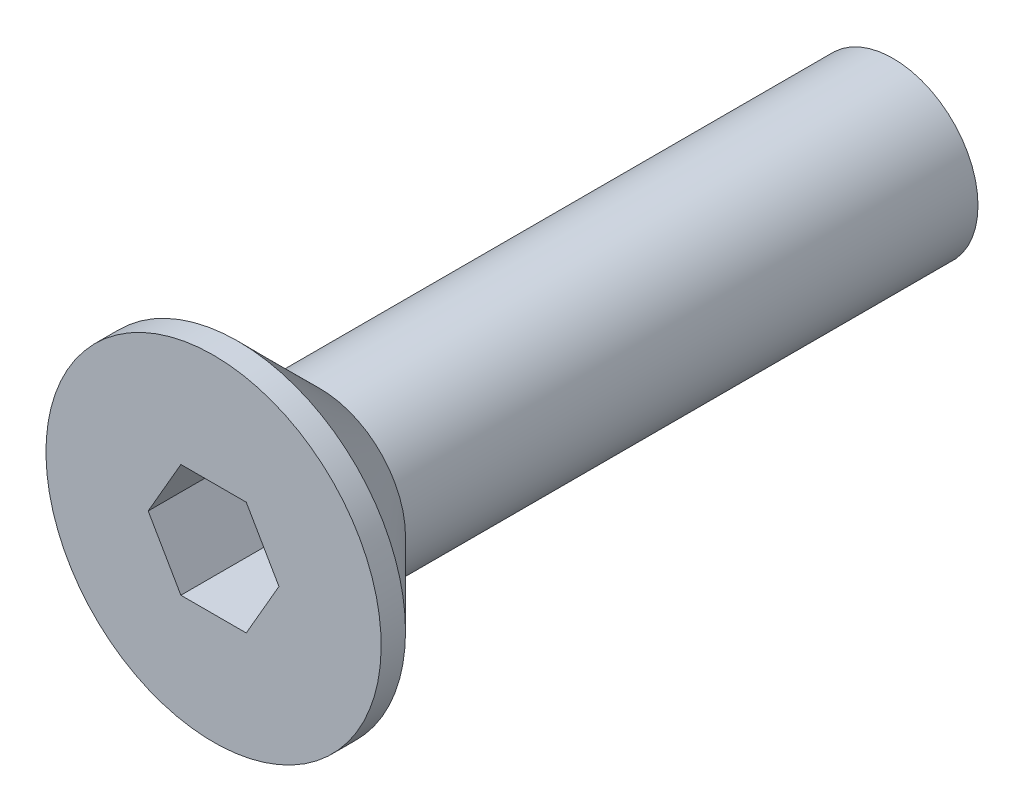
ISO-10303-21;
HEADER;
FILE_DESCRIPTION(('STEP AP214'),'2;1');
FILE_NAME('part.step','',(''),(''),'','','');
FILE_SCHEMA(('AUTOMOTIVE_DESIGN { 1 0 10303 214 1 1 1 1 }'));
ENDSEC;
DATA;
#1=APPLICATION_CONTEXT('core data for automotive mechanical design processes');
#2=APPLICATION_PROTOCOL_DEFINITION('international standard','automotive_design',2000,#1);
#3=PRODUCT_CONTEXT('',#1,'mechanical');
#4=PRODUCT('Part','Part','',(#3));
#5=PRODUCT_RELATED_PRODUCT_CATEGORY('part','',(#4));
#6=PRODUCT_DEFINITION_FORMATION('','',#4);
#7=PRODUCT_DEFINITION_CONTEXT('part definition',#1,'design');
#8=PRODUCT_DEFINITION('design','',#6,#7);
#9=PRODUCT_DEFINITION_SHAPE('','',#8);
#10=(LENGTH_UNIT() NAMED_UNIT(*) SI_UNIT(.MILLI.,.METRE.));
#11=(NAMED_UNIT(*) PLANE_ANGLE_UNIT() SI_UNIT($,.RADIAN.));
#12=(NAMED_UNIT(*) SI_UNIT($,.STERADIAN.) SOLID_ANGLE_UNIT());
#13=UNCERTAINTY_MEASURE_WITH_UNIT(LENGTH_MEASURE(1.E-05),#10,'distance_accuracy_value','');
#14=(GEOMETRIC_REPRESENTATION_CONTEXT(3) GLOBAL_UNCERTAINTY_ASSIGNED_CONTEXT((#13)) GLOBAL_UNIT_ASSIGNED_CONTEXT((#10,
#11,#12)) REPRESENTATION_CONTEXT('',''));
#15=CARTESIAN_POINT('',(0.,0.,0.));
#16=DIRECTION('',(0.,0.,1.));
#17=DIRECTION('',(1.,0.,0.));
#18=AXIS2_PLACEMENT_3D('',#15,#16,#17);
#19=CARTESIAN_POINT('',(1.154700538,-1.,0.38));
#20=DIRECTION('',(0.,0.,-1.));
#21=DIRECTION('',(-1.,0.,0.));
#22=AXIS2_PLACEMENT_3D('',#19,#20,#21);
#23=PLANE('',#22);
#24=DIRECTION('',(0.499999999876835,-0.866025403855548,0.));
#25=VECTOR('',#24,1.);
#26=CARTESIAN_POINT('',(-0.8660254035,-0.5,0.38));
#27=LINE('',#26,#25);
#28=CARTESIAN_POINT('',(-1.15470053783863,-2.79508512689153E-10,0.38));
#29=VERTEX_POINT('',#28);
#30=CARTESIAN_POINT('',(-0.577350269,-1.,0.38));
#31=VERTEX_POINT('',#30);
#32=EDGE_CURVE('E64',#29,#31,#27,.T.);
#33=ORIENTED_EDGE('',*,*,#32,.T.);
#34=DIRECTION('',(1.,0.,0.));
#35=VECTOR('',#34,1.);
#36=CARTESIAN_POINT('',(0.,-1.,0.38));
#37=LINE('',#36,#35);
#38=CARTESIAN_POINT('',(0.577350269,-1.,0.38));
#39=VERTEX_POINT('',#38);
#40=EDGE_CURVE('E104',#31,#39,#37,.T.);
#41=ORIENTED_EDGE('',*,*,#40,.T.);
#42=DIRECTION('',(0.499999999876835,0.866025403855548,0.));
#43=VECTOR('',#42,1.);
#44=CARTESIAN_POINT('',(0.8660254035,-0.5,0.38));
#45=LINE('',#44,#43);
#46=CARTESIAN_POINT('',(1.15470053767725,5.59017025378306E-10,0.38));
#47=VERTEX_POINT('',#46);
#48=EDGE_CURVE('E101',#39,#47,#45,.T.);
#49=ORIENTED_EDGE('',*,*,#48,.T.);
#50=DIRECTION('',(-0.499999999876835,0.866025403855548,0.));
#51=VECTOR('',#50,1.);
#52=CARTESIAN_POINT('',(0.8660254035,0.5,0.38));
#53=LINE('',#52,#51);
#54=CARTESIAN_POINT('',(0.577350269,1.,0.38));
#55=VERTEX_POINT('',#54);
#56=EDGE_CURVE('E75',#47,#55,#53,.T.);
#57=ORIENTED_EDGE('',*,*,#56,.T.);
#58=DIRECTION('',(-1.,0.,0.));
#59=VECTOR('',#58,1.);
#60=CARTESIAN_POINT('',(0.,1.,0.38));
#61=LINE('',#60,#59);
#62=CARTESIAN_POINT('',(-0.577350269,1.,0.38));
#63=VERTEX_POINT('',#62);
#64=EDGE_CURVE('E77',#55,#63,#61,.T.);
#65=ORIENTED_EDGE('',*,*,#64,.T.);
#66=DIRECTION('',(-0.499999999876835,-0.866025403855548,0.));
#67=VECTOR('',#66,1.);
#68=CARTESIAN_POINT('',(-0.8660254035,0.5,0.38));
#69=LINE('',#68,#67);
#70=EDGE_CURVE('E79',#63,#29,#69,.T.);
#71=ORIENTED_EDGE('',*,*,#70,.T.);
#72=EDGE_LOOP('',(#33,#41,#49,#57,#65,#71));
#73=FACE_BOUND('',#72,.T.);
#74=ADVANCED_FACE('F17',(#73),#23,.F.);
#75=CARTESIAN_POINT('',(-0.577350269,1.,0.38));
#76=DIRECTION('',(-0.866025403855548,0.499999999876835,0.));
#77=DIRECTION('',(-0.499999999876835,-0.866025403855548,0.));
#78=AXIS2_PLACEMENT_3D('',#75,#76,#77);
#79=PLANE('',#78);
#80=DIRECTION('',(0.,0.,-1.));
#81=VECTOR('',#80,1.);
#82=CARTESIAN_POINT('',(-1.154700538,0.,1.13));
#83=LINE('',#82,#81);
#84=CARTESIAN_POINT('',(-1.15470053958708,-2.49900252401181E-10,1.88));
#85=VERTEX_POINT('',#84);
#86=EDGE_CURVE('E87',#85,#29,#83,.T.);
#87=ORIENTED_EDGE('',*,*,#86,.T.);
#88=ORIENTED_EDGE('',*,*,#70,.F.);
#89=DIRECTION('',(0.,0.,1.));
#90=VECTOR('',#89,1.);
#91=CARTESIAN_POINT('',(-0.577350269,1.,1.13));
#92=LINE('',#91,#90);
#93=CARTESIAN_POINT('',(-0.57735026957712,1.00000000096384,1.88));
#94=VERTEX_POINT('',#93);
#95=EDGE_CURVE('E83',#63,#94,#92,.T.);
#96=ORIENTED_EDGE('',*,*,#95,.T.);
#97=DIRECTION('',(0.500000000144615,0.866025403700945,0.));
#98=VECTOR('',#97,1.);
#99=CARTESIAN_POINT('',(-1.15470054030848,0.,1.88));
#100=LINE('',#99,#98);
#101=EDGE_CURVE('E21',#85,#94,#100,.T.);
#102=ORIENTED_EDGE('',*,*,#101,.F.);
#103=EDGE_LOOP('',(#87,#88,#96,#102));
#104=FACE_BOUND('',#103,.T.);
#105=ADVANCED_FACE('F85',(#104),#79,.F.);
#106=CARTESIAN_POINT('',(-0.577350269,1.,0.38));
#107=DIRECTION('',(0.,1.,0.));
#108=DIRECTION('',(0.,0.,1.));
#109=AXIS2_PLACEMENT_3D('',#106,#107,#108);
#110=PLANE('',#109);
#111=ORIENTED_EDGE('',*,*,#95,.F.);
#112=ORIENTED_EDGE('',*,*,#64,.F.);
#113=DIRECTION('',(0.,0.,1.));
#114=VECTOR('',#113,1.);
#115=CARTESIAN_POINT('',(0.577350269,1.,1.13));
#116=LINE('',#115,#114);
#117=CARTESIAN_POINT('',(0.57735026957712,1.00000000096384,1.88));
#118=VERTEX_POINT('',#117);
#119=EDGE_CURVE('E93',#55,#118,#116,.T.);
#120=ORIENTED_EDGE('',*,*,#119,.T.);
#121=DIRECTION('',(1.,0.,0.));
#122=VECTOR('',#121,1.);
#123=CARTESIAN_POINT('',(0.,1.00000000128512,1.88));
#124=LINE('',#123,#122);
#125=EDGE_CURVE('E91',#94,#118,#124,.T.);
#126=ORIENTED_EDGE('',*,*,#125,.F.);
#127=EDGE_LOOP('',(#111,#112,#120,#126));
#128=FACE_BOUND('',#127,.T.);
#129=ADVANCED_FACE('F89',(#128),#110,.F.);
#130=CARTESIAN_POINT('',(1.154700538,0.,0.38));
#131=DIRECTION('',(0.866025403855548,0.499999999876835,0.));
#132=DIRECTION('',(-0.499999999876835,0.866025403855548,0.));
#133=AXIS2_PLACEMENT_3D('',#130,#131,#132);
#134=PLANE('',#133);
#135=ORIENTED_EDGE('',*,*,#119,.F.);
#136=ORIENTED_EDGE('',*,*,#56,.F.);
#137=DIRECTION('',(0.,0.,1.));
#138=VECTOR('',#137,1.);
#139=CARTESIAN_POINT('',(1.154700538,0.,1.13));
#140=LINE('',#139,#138);
#141=CARTESIAN_POINT('',(1.15470053958708,-2.49900269626776E-10,1.88));
#142=VERTEX_POINT('',#141);
#143=EDGE_CURVE('E102',#47,#142,#140,.T.);
#144=ORIENTED_EDGE('',*,*,#143,.T.);
#145=DIRECTION('',(0.500000000144616,-0.866025403700945,0.));
#146=VECTOR('',#145,1.);
#147=CARTESIAN_POINT('',(0.57735027015424,1.00000000128512,1.88));
#148=LINE('',#147,#146);
#149=EDGE_CURVE('E99',#118,#142,#148,.T.);
#150=ORIENTED_EDGE('',*,*,#149,.F.);
#151=EDGE_LOOP('',(#135,#136,#144,#150));
#152=FACE_BOUND('',#151,.T.);
#153=ADVANCED_FACE('F130',(#152),#134,.F.);
#154=CARTESIAN_POINT('',(0.577350269,-1.,0.38));
#155=DIRECTION('',(0.866025403855548,-0.499999999876835,0.));
#156=DIRECTION('',(0.499999999876835,0.866025403855548,0.));
#157=AXIS2_PLACEMENT_3D('',#154,#155,#156);
#158=PLANE('',#157);
#159=ORIENTED_EDGE('',*,*,#143,.F.);
#160=ORIENTED_EDGE('',*,*,#48,.F.);
#161=DIRECTION('',(0.,0.,1.));
#162=VECTOR('',#161,1.);
#163=CARTESIAN_POINT('',(0.577350269,-1.,1.13));
#164=LINE('',#163,#162);
#165=CARTESIAN_POINT('',(0.57735026957712,-1.00000000096384,1.88));
#166=VERTEX_POINT('',#165);
#167=EDGE_CURVE('E105',#39,#166,#164,.T.);
#168=ORIENTED_EDGE('',*,*,#167,.T.);
#169=DIRECTION('',(-0.500000000144616,-0.866025403700944,0.));
#170=VECTOR('',#169,1.);
#171=CARTESIAN_POINT('',(1.15470054030848,0.,1.88));
#172=LINE('',#171,#170);
#173=EDGE_CURVE('E120',#142,#166,#172,.T.);
#174=ORIENTED_EDGE('',*,*,#173,.F.);
#175=EDGE_LOOP('',(#159,#160,#168,#174));
#176=FACE_BOUND('',#175,.T.);
#177=ADVANCED_FACE('F134',(#176),#158,.F.);
#178=CARTESIAN_POINT('',(-0.577350269,-1.,1.88));
#179=DIRECTION('',(0.,-1.,0.));
#180=DIRECTION('',(0.,0.,-1.));
#181=AXIS2_PLACEMENT_3D('',#178,#179,#180);
#182=PLANE('',#181);
#183=ORIENTED_EDGE('',*,*,#167,.F.);
#184=ORIENTED_EDGE('',*,*,#40,.F.);
#185=DIRECTION('',(0.,0.,1.));
#186=VECTOR('',#185,1.);
#187=CARTESIAN_POINT('',(-0.577350269,-1.,1.13));
#188=LINE('',#187,#186);
#189=CARTESIAN_POINT('',(-0.57735026957712,-1.00000000096384,1.88));
#190=VERTEX_POINT('',#189);
#191=EDGE_CURVE('E36',#31,#190,#188,.T.);
#192=ORIENTED_EDGE('',*,*,#191,.T.);
#193=DIRECTION('',(-1.,0.,0.));
#194=VECTOR('',#193,1.);
#195=CARTESIAN_POINT('',(0.,-1.00000000128512,1.88));
#196=LINE('',#195,#194);
#197=EDGE_CURVE('E119',#166,#190,#196,.T.);
#198=ORIENTED_EDGE('',*,*,#197,.F.);
#199=EDGE_LOOP('',(#183,#184,#192,#198));
#200=FACE_BOUND('',#199,.T.);
#201=ADVANCED_FACE('F136',(#200),#182,.F.);
#202=CARTESIAN_POINT('',(-1.154700538,0.,0.38));
#203=DIRECTION('',(-0.866025403855548,-0.499999999876835,0.));
#204=DIRECTION('',(0.499999999876835,-0.866025403855548,0.));
#205=AXIS2_PLACEMENT_3D('',#202,#203,#204);
#206=PLANE('',#205);
#207=ORIENTED_EDGE('',*,*,#191,.F.);
#208=ORIENTED_EDGE('',*,*,#32,.F.);
#209=ORIENTED_EDGE('',*,*,#86,.F.);
#210=DIRECTION('',(-0.500000000144615,0.866025403700945,0.));
#211=VECTOR('',#210,1.);
#212=CARTESIAN_POINT('',(-0.57735027015424,-1.00000000128512,1.88));
#213=LINE('',#212,#211);
#214=EDGE_CURVE('E116',#190,#85,#213,.T.);
#215=ORIENTED_EDGE('',*,*,#214,.F.);
#216=EDGE_LOOP('',(#207,#208,#209,#215));
#217=FACE_BOUND('',#216,.T.);
#218=ADVANCED_FACE('F185',(#217),#206,.F.);
#219=CARTESIAN_POINT('',(1.518,-1.518,-10.12));
#220=DIRECTION('',(0.,0.,-1.));
#221=DIRECTION('',(-1.,0.,0.));
#222=AXIS2_PLACEMENT_3D('',#219,#220,#221);
#223=PLANE('',#222);
#224=CARTESIAN_POINT('',(0.,0.,-10.12));
#225=DIRECTION('',(0.,0.,1.));
#226=DIRECTION('',(1.,0.,0.));
#227=AXIS2_PLACEMENT_3D('',#224,#225,#226);
#228=CIRCLE('',#227,1.5);
#229=CARTESIAN_POINT('',(1.5,0.,-10.12));
#230=VERTEX_POINT('',#229);
#231=EDGE_CURVE('E113',#230,#230,#228,.F.);
#232=ORIENTED_EDGE('',*,*,#231,.T.);
#233=EDGE_LOOP('',(#232));
#234=FACE_BOUND('',#233,.T.);
#235=ADVANCED_FACE('F170',(#234),#223,.T.);
#236=CARTESIAN_POINT('',(-2.99552,-2.99552,1.88));
#237=DIRECTION('',(0.,0.,1.));
#238=DIRECTION('',(1.,0.,0.));
#239=AXIS2_PLACEMENT_3D('',#236,#237,#238);
#240=PLANE('',#239);
#241=ORIENTED_EDGE('',*,*,#197,.T.);
#242=ORIENTED_EDGE('',*,*,#214,.T.);
#243=ORIENTED_EDGE('',*,*,#101,.T.);
#244=ORIENTED_EDGE('',*,*,#125,.T.);
#245=ORIENTED_EDGE('',*,*,#149,.T.);
#246=ORIENTED_EDGE('',*,*,#173,.T.);
#247=EDGE_LOOP('',(#241,#242,#243,#244,#245,#246));
#248=FACE_BOUND('',#247,.T.);
#249=CARTESIAN_POINT('',(0.,0.,1.88));
#250=DIRECTION('',(0.,0.,-1.));
#251=DIRECTION('',(0.,1.,0.));
#252=AXIS2_PLACEMENT_3D('',#249,#250,#251);
#253=CIRCLE('',#252,2.96);
#254=CARTESIAN_POINT('',(0.,2.96,1.88));
#255=VERTEX_POINT('',#254);
#256=EDGE_CURVE('E110',#255,#255,#253,.F.);
#257=ORIENTED_EDGE('',*,*,#256,.T.);
#258=EDGE_LOOP('',(#257));
#259=FACE_BOUND('',#258,.T.);
#260=ADVANCED_FACE('F126',(#248,#259),#240,.T.);
#261=CARTESIAN_POINT('',(0.,0.,-10.12));
#262=DIRECTION('',(0.,0.,1.));
#263=DIRECTION('',(1.,0.,0.));
#264=AXIS2_PLACEMENT_3D('',#261,#262,#263);
#265=CYLINDRICAL_SURFACE('',#264,1.5);
#266=ORIENTED_EDGE('',*,*,#231,.F.);
#267=EDGE_LOOP('',(#266));
#268=FACE_BOUND('',#267,.T.);
#269=CARTESIAN_POINT('',(0.,0.,0.));
#270=DIRECTION('',(0.,0.,1.));
#271=DIRECTION('',(1.,0.,0.));
#272=AXIS2_PLACEMENT_3D('',#269,#270,#271);
#273=CIRCLE('',#272,1.5);
#274=CARTESIAN_POINT('',(1.5,0.,0.));
#275=VERTEX_POINT('',#274);
#276=EDGE_CURVE('E107',#275,#275,#273,.F.);
#277=ORIENTED_EDGE('',*,*,#276,.T.);
#278=EDGE_LOOP('',(#277));
#279=FACE_BOUND('',#278,.T.);
#280=ADVANCED_FACE('F160',(#268,#279),#265,.T.);
#281=CARTESIAN_POINT('',(0.,0.,1.88));
#282=DIRECTION('',(0.,0.,-1.));
#283=DIRECTION('',(0.,1.,0.));
#284=AXIS2_PLACEMENT_3D('',#281,#282,#283);
#285=CYLINDRICAL_SURFACE('',#284,2.96);
#286=CARTESIAN_POINT('',(0.,0.,1.44999999999995));
#287=DIRECTION('',(0.,0.,1.));
#288=DIRECTION('',(1.,0.,0.));
#289=AXIS2_PLACEMENT_3D('',#286,#287,#288);
#290=CIRCLE('',#289,2.96);
#291=CARTESIAN_POINT('',(2.96,0.,1.45));
#292=VERTEX_POINT('',#291);
#293=EDGE_CURVE('E27',#292,#292,#290,.T.);
#294=ORIENTED_EDGE('',*,*,#293,.T.);
#295=EDGE_LOOP('',(#294));
#296=FACE_BOUND('',#295,.T.);
#297=ORIENTED_EDGE('',*,*,#256,.F.);
#298=EDGE_LOOP('',(#297));
#299=FACE_BOUND('',#298,.T.);
#300=ADVANCED_FACE('F145',(#296,#299),#285,.T.);
#301=CARTESIAN_POINT('',(-1.52812,-1.52812,0.));
#302=DIRECTION('',(0.,0.,1.));
#303=DIRECTION('',(1.,0.,0.));
#304=AXIS2_PLACEMENT_3D('',#301,#302,#303);
#305=PLANE('',#304);
#306=ORIENTED_EDGE('',*,*,#276,.F.);
#307=EDGE_LOOP('',(#306));
#308=FACE_BOUND('',#307,.T.);
#309=CARTESIAN_POINT('',(0.,0.,0.));
#310=DIRECTION('',(0.,0.,1.));
#311=DIRECTION('',(1.,0.,0.));
#312=AXIS2_PLACEMENT_3D('',#309,#310,#311);
#313=CIRCLE('',#312,1.51);
#314=CARTESIAN_POINT('',(1.51,0.,0.));
#315=VERTEX_POINT('',#314);
#316=EDGE_CURVE('E11',#315,#315,#313,.F.);
#317=ORIENTED_EDGE('',*,*,#316,.T.);
#318=EDGE_LOOP('',(#317));
#319=FACE_BOUND('',#318,.T.);
#320=ADVANCED_FACE('F19',(#308,#319),#305,.F.);
#321=CARTESIAN_POINT('',(0.,0.,0.));
#322=DIRECTION('',(0.,0.,1.));
#323=DIRECTION('',(1.,0.,0.));
#324=AXIS2_PLACEMENT_3D('',#321,#322,#323);
#325=CONICAL_SURFACE('',#324,1.51,0.785398163397448);
#326=ORIENTED_EDGE('',*,*,#293,.F.);
#327=EDGE_LOOP('',(#326));
#328=FACE_BOUND('',#327,.T.);
#329=ORIENTED_EDGE('',*,*,#316,.F.);
#330=EDGE_LOOP('',(#329));
#331=FACE_BOUND('',#330,.T.);
#332=ADVANCED_FACE('F148',(#328,#331),#325,.T.);
#333=CLOSED_SHELL('',(#74,#105,#129,#153,#177,#201,#218,#235,#260,#280,#300,#320,#332));
#334=MANIFOLD_SOLID_BREP('B1',#333);
#335=ADVANCED_BREP_SHAPE_REPRESENTATION('',(#18,#334),#14);
#336=SHAPE_DEFINITION_REPRESENTATION(#9,#335);
ENDSEC;
END-ISO-10303-21;
